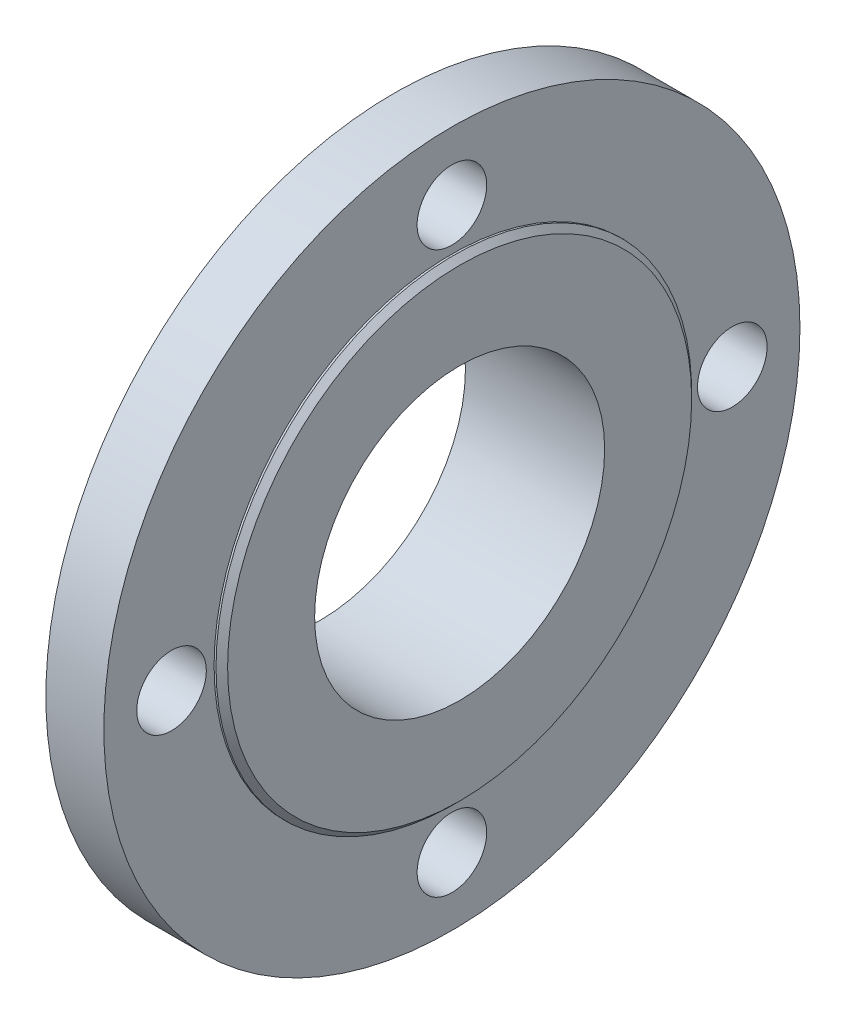
ISO-10303-21;
HEADER;
FILE_DESCRIPTION(('STEP AP214'),'2;1');
FILE_NAME('part.step','',(''),(''),'','','');
FILE_SCHEMA(('AUTOMOTIVE_DESIGN { 1 0 10303 214 1 1 1 1 }'));
ENDSEC;
DATA;
#1=APPLICATION_CONTEXT('core data for automotive mechanical design processes');
#2=APPLICATION_PROTOCOL_DEFINITION('international standard','automotive_design',2000,#1);
#3=PRODUCT_CONTEXT('',#1,'mechanical');
#4=PRODUCT('Part','Part','',(#3));
#5=PRODUCT_RELATED_PRODUCT_CATEGORY('part','',(#4));
#6=PRODUCT_DEFINITION_FORMATION('','',#4);
#7=PRODUCT_DEFINITION_CONTEXT('part definition',#1,'design');
#8=PRODUCT_DEFINITION('design','',#6,#7);
#9=PRODUCT_DEFINITION_SHAPE('','',#8);
#10=(LENGTH_UNIT() NAMED_UNIT(*) SI_UNIT(.MILLI.,.METRE.));
#11=(NAMED_UNIT(*) PLANE_ANGLE_UNIT() SI_UNIT($,.RADIAN.));
#12=(NAMED_UNIT(*) SI_UNIT($,.STERADIAN.) SOLID_ANGLE_UNIT());
#13=UNCERTAINTY_MEASURE_WITH_UNIT(LENGTH_MEASURE(1.E-05),#10,'distance_accuracy_value','');
#14=(GEOMETRIC_REPRESENTATION_CONTEXT(3) GLOBAL_UNCERTAINTY_ASSIGNED_CONTEXT((#13)) GLOBAL_UNIT_ASSIGNED_CONTEXT((#10,
#11,#12)) REPRESENTATION_CONTEXT('',''));
#15=CARTESIAN_POINT('',(0.,0.,0.));
#16=DIRECTION('',(0.,0.,1.));
#17=DIRECTION('',(1.,0.,0.));
#18=AXIS2_PLACEMENT_3D('',#15,#16,#17);
#19=CARTESIAN_POINT('',(0.,37.5,0.));
#20=DIRECTION('',(1.,0.,0.));
#21=DIRECTION('',(0.,0.,-1.));
#22=AXIS2_PLACEMENT_3D('',#19,#20,#21);
#23=PLANE('',#22);
#24=CARTESIAN_POINT('',(0.,0.,0.));
#25=DIRECTION('',(1.,0.,0.));
#26=DIRECTION('',(0.,0.,-1.));
#27=AXIS2_PLACEMENT_3D('',#24,#25,#26);
#28=CIRCLE('',#27,90.);
#29=CARTESIAN_POINT('',(0.,0.,-90.));
#30=VERTEX_POINT('',#29);
#31=EDGE_CURVE('E49',#30,#30,#28,.T.);
#32=ORIENTED_EDGE('',*,*,#31,.T.);
#33=EDGE_LOOP('',(#32));
#34=FACE_BOUND('',#33,.T.);
#35=CARTESIAN_POINT('',(0.,72.5,0.));
#36=DIRECTION('',(1.,0.,0.));
#37=DIRECTION('',(0.,0.,-1.));
#38=AXIS2_PLACEMENT_3D('',#35,#36,#37);
#39=CIRCLE('',#38,9.);
#40=CARTESIAN_POINT('',(0.,72.5,-9.));
#41=VERTEX_POINT('',#40);
#42=EDGE_CURVE('E55',#41,#41,#39,.T.);
#43=ORIENTED_EDGE('',*,*,#42,.F.);
#44=EDGE_LOOP('',(#43));
#45=FACE_BOUND('',#44,.T.);
#46=CARTESIAN_POINT('',(0.,-2.5313254368043E-13,72.5));
#47=DIRECTION('',(1.,0.,0.));
#48=DIRECTION('',(0.,1.,0.));
#49=AXIS2_PLACEMENT_3D('',#46,#47,#48);
#50=CIRCLE('',#49,9.);
#51=CARTESIAN_POINT('',(0.,8.99999999999974,72.5));
#52=VERTEX_POINT('',#51);
#53=EDGE_CURVE('E69',#52,#52,#50,.T.);
#54=ORIENTED_EDGE('',*,*,#53,.F.);
#55=EDGE_LOOP('',(#54));
#56=FACE_BOUND('',#55,.T.);
#57=CARTESIAN_POINT('',(0.,-72.5,-5.0626508736086E-13));
#58=DIRECTION('',(1.,0.,0.));
#59=DIRECTION('',(0.,0.,1.));
#60=AXIS2_PLACEMENT_3D('',#57,#58,#59);
#61=CIRCLE('',#60,9.);
#62=CARTESIAN_POINT('',(0.,-72.5000000000001,8.99999999999949));
#63=VERTEX_POINT('',#62);
#64=EDGE_CURVE('E75',#63,#63,#61,.T.);
#65=ORIENTED_EDGE('',*,*,#64,.F.);
#66=EDGE_LOOP('',(#65));
#67=FACE_BOUND('',#66,.T.);
#68=CARTESIAN_POINT('',(0.,7.59397631041291E-13,-72.5));
#69=DIRECTION('',(1.,0.,0.));
#70=DIRECTION('',(0.,-1.,0.));
#71=AXIS2_PLACEMENT_3D('',#68,#69,#70);
#72=CIRCLE('',#71,9.);
#73=CARTESIAN_POINT('',(0.,-8.99999999999924,-72.5000000000001));
#74=VERTEX_POINT('',#73);
#75=EDGE_CURVE('E81',#74,#74,#72,.T.);
#76=ORIENTED_EDGE('',*,*,#75,.F.);
#77=EDGE_LOOP('',(#76));
#78=FACE_BOUND('',#77,.T.);
#79=CARTESIAN_POINT('',(0.,0.,0.));
#80=DIRECTION('',(1.,0.,0.));
#81=DIRECTION('',(0.,0.,-1.));
#82=AXIS2_PLACEMENT_3D('',#79,#80,#81);
#83=CIRCLE('',#82,61.5);
#84=CARTESIAN_POINT('',(0.,0.,-61.5));
#85=VERTEX_POINT('',#84);
#86=EDGE_CURVE('E87',#85,#85,#83,.T.);
#87=ORIENTED_EDGE('',*,*,#86,.F.);
#88=EDGE_LOOP('',(#87));
#89=FACE_BOUND('',#88,.T.);
#90=ADVANCED_FACE('F34',(#34,#45,#56,#67,#78,#89),#23,.T.);
#91=CARTESIAN_POINT('',(-34.,44.7,0.));
#92=DIRECTION('',(-1.,0.,0.));
#93=DIRECTION('',(0.,0.,1.));
#94=AXIS2_PLACEMENT_3D('',#91,#92,#93);
#95=PLANE('',#94);
#96=CARTESIAN_POINT('',(-34.,0.,0.));
#97=DIRECTION('',(1.,0.,0.));
#98=DIRECTION('',(0.,0.,-1.));
#99=AXIS2_PLACEMENT_3D('',#96,#97,#98);
#100=CIRCLE('',#99,37.5);
#101=CARTESIAN_POINT('',(-34.,0.,-37.5));
#102=VERTEX_POINT('',#101);
#103=EDGE_CURVE('E45',#102,#102,#100,.T.);
#104=ORIENTED_EDGE('',*,*,#103,.T.);
#105=EDGE_LOOP('',(#104));
#106=FACE_BOUND('',#105,.T.);
#107=CARTESIAN_POINT('',(-34.,0.,0.));
#108=DIRECTION('',(1.,0.,0.));
#109=DIRECTION('',(0.,0.,-1.));
#110=AXIS2_PLACEMENT_3D('',#107,#108,#109);
#111=CIRCLE('',#110,44.7);
#112=CARTESIAN_POINT('',(-34.,0.,-44.7));
#113=VERTEX_POINT('',#112);
#114=EDGE_CURVE('E54',#113,#113,#111,.T.);
#115=ORIENTED_EDGE('',*,*,#114,.F.);
#116=EDGE_LOOP('',(#115));
#117=FACE_BOUND('',#116,.T.);
#118=ADVANCED_FACE('F110',(#106,#117),#95,.T.);
#119=CARTESIAN_POINT('',(0.,0.,0.));
#120=DIRECTION('',(1.,0.,0.));
#121=DIRECTION('',(0.,0.,-1.));
#122=AXIS2_PLACEMENT_3D('',#119,#120,#121);
#123=CYLINDRICAL_SURFACE('',#122,37.5);
#124=ORIENTED_EDGE('',*,*,#103,.F.);
#125=EDGE_LOOP('',(#124));
#126=FACE_BOUND('',#125,.T.);
#127=CARTESIAN_POINT('',(2.,0.,0.));
#128=DIRECTION('',(1.,0.,0.));
#129=DIRECTION('',(0.,0.,-1.));
#130=AXIS2_PLACEMENT_3D('',#127,#128,#129);
#131=CIRCLE('',#130,37.5);
#132=CARTESIAN_POINT('',(2.,0.,-37.5));
#133=VERTEX_POINT('',#132);
#134=EDGE_CURVE('E90',#133,#133,#131,.T.);
#135=ORIENTED_EDGE('',*,*,#134,.T.);
#136=EDGE_LOOP('',(#135));
#137=FACE_BOUND('',#136,.T.);
#138=ADVANCED_FACE('F94',(#126,#137),#123,.F.);
#139=CARTESIAN_POINT('',(0.,0.,0.));
#140=DIRECTION('',(1.,0.,0.));
#141=DIRECTION('',(0.,0.,-1.));
#142=AXIS2_PLACEMENT_3D('',#139,#140,#141);
#143=CYLINDRICAL_SURFACE('',#142,90.);
#144=CARTESIAN_POINT('',(-15.,0.,0.));
#145=DIRECTION('',(1.,0.,0.));
#146=DIRECTION('',(0.,0.,-1.));
#147=AXIS2_PLACEMENT_3D('',#144,#145,#146);
#148=CIRCLE('',#147,90.);
#149=CARTESIAN_POINT('',(-15.,0.,-90.));
#150=VERTEX_POINT('',#149);
#151=EDGE_CURVE('E59',#150,#150,#148,.T.);
#152=ORIENTED_EDGE('',*,*,#151,.T.);
#153=EDGE_LOOP('',(#152));
#154=FACE_BOUND('',#153,.T.);
#155=ORIENTED_EDGE('',*,*,#31,.F.);
#156=EDGE_LOOP('',(#155));
#157=FACE_BOUND('',#156,.T.);
#158=ADVANCED_FACE('F120',(#154,#157),#143,.T.);
#159=CARTESIAN_POINT('',(-15.,90.,0.));
#160=DIRECTION('',(-1.,0.,0.));
#161=DIRECTION('',(0.,0.,1.));
#162=AXIS2_PLACEMENT_3D('',#159,#160,#161);
#163=PLANE('',#162);
#164=CARTESIAN_POINT('',(-15.,7.59397631041291E-13,-72.5));
#165=DIRECTION('',(-1.,0.,0.));
#166=DIRECTION('',(0.,1.,0.));
#167=AXIS2_PLACEMENT_3D('',#164,#165,#166);
#168=CIRCLE('',#167,9.);
#169=CARTESIAN_POINT('',(-15.,9.00000000000076,-72.4999999999999));
#170=VERTEX_POINT('',#169);
#171=EDGE_CURVE('E84',#170,#170,#168,.T.);
#172=ORIENTED_EDGE('',*,*,#171,.F.);
#173=EDGE_LOOP('',(#172));
#174=FACE_BOUND('',#173,.T.);
#175=CARTESIAN_POINT('',(-15.,-72.5,-5.0626508736086E-13));
#176=DIRECTION('',(-1.,0.,0.));
#177=DIRECTION('',(0.,0.,-1.));
#178=AXIS2_PLACEMENT_3D('',#175,#176,#177);
#179=CIRCLE('',#178,9.);
#180=CARTESIAN_POINT('',(-15.,-72.4999999999999,-9.0000000000005));
#181=VERTEX_POINT('',#180);
#182=EDGE_CURVE('E78',#181,#181,#179,.T.);
#183=ORIENTED_EDGE('',*,*,#182,.F.);
#184=EDGE_LOOP('',(#183));
#185=FACE_BOUND('',#184,.T.);
#186=CARTESIAN_POINT('',(-15.,-2.5313254368043E-13,72.5));
#187=DIRECTION('',(-1.,0.,0.));
#188=DIRECTION('',(0.,-1.,0.));
#189=AXIS2_PLACEMENT_3D('',#186,#187,#188);
#190=CIRCLE('',#189,9.);
#191=CARTESIAN_POINT('',(-15.,-9.00000000000025,72.5));
#192=VERTEX_POINT('',#191);
#193=EDGE_CURVE('E72',#192,#192,#190,.T.);
#194=ORIENTED_EDGE('',*,*,#193,.F.);
#195=EDGE_LOOP('',(#194));
#196=FACE_BOUND('',#195,.T.);
#197=CARTESIAN_POINT('',(-15.,72.5,0.));
#198=DIRECTION('',(-1.,0.,0.));
#199=DIRECTION('',(0.,0.,1.));
#200=AXIS2_PLACEMENT_3D('',#197,#198,#199);
#201=CIRCLE('',#200,9.);
#202=CARTESIAN_POINT('',(-15.,72.5,9.));
#203=VERTEX_POINT('',#202);
#204=EDGE_CURVE('E52',#203,#203,#201,.T.);
#205=ORIENTED_EDGE('',*,*,#204,.F.);
#206=EDGE_LOOP('',(#205));
#207=FACE_BOUND('',#206,.T.);
#208=CARTESIAN_POINT('',(-15.,0.,0.));
#209=DIRECTION('',(1.,0.,0.));
#210=DIRECTION('',(0.,0.,-1.));
#211=AXIS2_PLACEMENT_3D('',#208,#209,#210);
#212=CIRCLE('',#211,44.7);
#213=CARTESIAN_POINT('',(-15.,0.,-44.7));
#214=VERTEX_POINT('',#213);
#215=EDGE_CURVE('E62',#214,#214,#212,.T.);
#216=ORIENTED_EDGE('',*,*,#215,.T.);
#217=EDGE_LOOP('',(#216));
#218=FACE_BOUND('',#217,.T.);
#219=ORIENTED_EDGE('',*,*,#151,.F.);
#220=EDGE_LOOP('',(#219));
#221=FACE_BOUND('',#220,.T.);
#222=ADVANCED_FACE('F127',(#174,#185,#196,#207,#218,#221),#163,.T.);
#223=CARTESIAN_POINT('',(0.,0.,0.));
#224=DIRECTION('',(1.,0.,0.));
#225=DIRECTION('',(0.,0.,-1.));
#226=AXIS2_PLACEMENT_3D('',#223,#224,#225);
#227=CYLINDRICAL_SURFACE('',#226,44.7);
#228=ORIENTED_EDGE('',*,*,#114,.T.);
#229=EDGE_LOOP('',(#228));
#230=FACE_BOUND('',#229,.T.);
#231=ORIENTED_EDGE('',*,*,#215,.F.);
#232=EDGE_LOOP('',(#231));
#233=FACE_BOUND('',#232,.T.);
#234=ADVANCED_FACE('F133',(#230,#233),#227,.T.);
#235=CARTESIAN_POINT('',(-34.,72.5,0.));
#236=DIRECTION('',(1.,0.,0.));
#237=DIRECTION('',(0.,0.,-1.));
#238=AXIS2_PLACEMENT_3D('',#235,#236,#237);
#239=CYLINDRICAL_SURFACE('',#238,9.);
#240=ORIENTED_EDGE('',*,*,#204,.T.);
#241=EDGE_LOOP('',(#240));
#242=FACE_BOUND('',#241,.T.);
#243=ORIENTED_EDGE('',*,*,#42,.T.);
#244=EDGE_LOOP('',(#243));
#245=FACE_BOUND('',#244,.T.);
#246=ADVANCED_FACE('F136',(#242,#245),#239,.F.);
#247=CARTESIAN_POINT('',(-34.,-2.5313254368043E-13,72.5));
#248=DIRECTION('',(1.,0.,0.));
#249=DIRECTION('',(0.,1.,0.));
#250=AXIS2_PLACEMENT_3D('',#247,#248,#249);
#251=CYLINDRICAL_SURFACE('',#250,9.);
#252=ORIENTED_EDGE('',*,*,#193,.T.);
#253=EDGE_LOOP('',(#252));
#254=FACE_BOUND('',#253,.T.);
#255=ORIENTED_EDGE('',*,*,#53,.T.);
#256=EDGE_LOOP('',(#255));
#257=FACE_BOUND('',#256,.T.);
#258=ADVANCED_FACE('F153',(#254,#257),#251,.F.);
#259=CARTESIAN_POINT('',(-34.,-72.5,-5.0626508736086E-13));
#260=DIRECTION('',(1.,0.,0.));
#261=DIRECTION('',(0.,0.,1.));
#262=AXIS2_PLACEMENT_3D('',#259,#260,#261);
#263=CYLINDRICAL_SURFACE('',#262,9.);
#264=ORIENTED_EDGE('',*,*,#182,.T.);
#265=EDGE_LOOP('',(#264));
#266=FACE_BOUND('',#265,.T.);
#267=ORIENTED_EDGE('',*,*,#64,.T.);
#268=EDGE_LOOP('',(#267));
#269=FACE_BOUND('',#268,.T.);
#270=ADVANCED_FACE('F106',(#266,#269),#263,.F.);
#271=CARTESIAN_POINT('',(-34.,7.59397631041291E-13,-72.5));
#272=DIRECTION('',(1.,0.,0.));
#273=DIRECTION('',(0.,-1.,0.));
#274=AXIS2_PLACEMENT_3D('',#271,#272,#273);
#275=CYLINDRICAL_SURFACE('',#274,9.);
#276=ORIENTED_EDGE('',*,*,#171,.T.);
#277=EDGE_LOOP('',(#276));
#278=FACE_BOUND('',#277,.T.);
#279=ORIENTED_EDGE('',*,*,#75,.T.);
#280=EDGE_LOOP('',(#279));
#281=FACE_BOUND('',#280,.T.);
#282=ADVANCED_FACE('F99',(#278,#281),#275,.F.);
#283=CARTESIAN_POINT('',(2.,0.,0.));
#284=DIRECTION('',(1.,0.,0.));
#285=DIRECTION('',(0.,0.,-1.));
#286=AXIS2_PLACEMENT_3D('',#283,#284,#285);
#287=PLANE('',#286);
#288=CARTESIAN_POINT('',(2.,0.,0.));
#289=DIRECTION('',(1.,0.,0.));
#290=DIRECTION('',(0.,0.,-1.));
#291=AXIS2_PLACEMENT_3D('',#288,#289,#290);
#292=CIRCLE('',#291,60.);
#293=CARTESIAN_POINT('',(2.,0.,60.));
#294=VERTEX_POINT('',#293);
#295=EDGE_CURVE('E41',#294,#294,#292,.T.);
#296=ORIENTED_EDGE('',*,*,#295,.T.);
#297=EDGE_LOOP('',(#296));
#298=FACE_BOUND('',#297,.T.);
#299=ORIENTED_EDGE('',*,*,#134,.F.);
#300=EDGE_LOOP('',(#299));
#301=FACE_BOUND('',#300,.T.);
#302=ADVANCED_FACE('F96',(#298,#301),#287,.T.);
#303=CARTESIAN_POINT('',(2.,0.,0.));
#304=DIRECTION('',(-1.,0.,0.));
#305=DIRECTION('',(0.,0.,1.));
#306=AXIS2_PLACEMENT_3D('',#303,#304,#305);
#307=CYLINDRICAL_SURFACE('',#306,61.5);
#308=CARTESIAN_POINT('',(0.499999999999957,0.,0.));
#309=DIRECTION('',(1.,0.,0.));
#310=DIRECTION('',(0.,0.,-1.));
#311=AXIS2_PLACEMENT_3D('',#308,#309,#310);
#312=CIRCLE('',#311,61.5);
#313=CARTESIAN_POINT('',(0.499999999999957,0.,61.5));
#314=VERTEX_POINT('',#313);
#315=EDGE_CURVE('E10',#314,#314,#312,.F.);
#316=ORIENTED_EDGE('',*,*,#315,.T.);
#317=EDGE_LOOP('',(#316));
#318=FACE_BOUND('',#317,.T.);
#319=ORIENTED_EDGE('',*,*,#86,.T.);
#320=EDGE_LOOP('',(#319));
#321=FACE_BOUND('',#320,.T.);
#322=ADVANCED_FACE('F98',(#318,#321),#307,.T.);
#323=CARTESIAN_POINT('',(2.,0.,0.));
#324=DIRECTION('',(-1.,0.,0.));
#325=DIRECTION('',(0.,0.,1.));
#326=AXIS2_PLACEMENT_3D('',#323,#324,#325);
#327=CONICAL_SURFACE('',#326,60.,0.785398163397437);
#328=CARTESIAN_POINT('',(0.499999999999957,0.,61.5));
#329=CARTESIAN_POINT('',(0.515624999999956,0.,61.484375));
#330=CARTESIAN_POINT('',(0.531249999999957,0.,61.46875));
#331=CARTESIAN_POINT('',(0.562499999999959,0.,61.4375));
#332=CARTESIAN_POINT('',(0.57812499999996,0.,61.421875));
#333=CARTESIAN_POINT('',(0.609374999999961,0.,61.390625));
#334=CARTESIAN_POINT('',(0.624999999999961,0.,61.375));
#335=CARTESIAN_POINT('',(0.656249999999961,0.,61.34375));
#336=CARTESIAN_POINT('',(0.671874999999962,0.,61.328125));
#337=CARTESIAN_POINT('',(0.703124999999963,0.,61.296875));
#338=CARTESIAN_POINT('',(0.718749999999963,0.,61.28125));
#339=CARTESIAN_POINT('',(0.749999999999964,0.,61.25));
#340=CARTESIAN_POINT('',(0.765624999999964,0.,61.234375));
#341=CARTESIAN_POINT('',(0.796874999999965,0.,61.203125));
#342=CARTESIAN_POINT('',(0.812499999999966,0.,61.1875));
#343=CARTESIAN_POINT('',(0.843749999999967,0.,61.15625));
#344=CARTESIAN_POINT('',(0.859374999999967,0.,61.140625));
#345=CARTESIAN_POINT('',(0.890624999999968,0.,61.109375));
#346=CARTESIAN_POINT('',(0.906249999999968,0.,61.09375));
#347=CARTESIAN_POINT('',(0.937499999999969,0.,61.0625));
#348=CARTESIAN_POINT('',(0.95312499999997,0.,61.046875));
#349=CARTESIAN_POINT('',(0.98437499999997,0.,61.015625));
#350=CARTESIAN_POINT('',(0.999999999999971,0.,61.));
#351=CARTESIAN_POINT('',(1.03124999999997,0.,60.96875));
#352=CARTESIAN_POINT('',(1.04687499999997,0.,60.953125));
#353=CARTESIAN_POINT('',(1.07812499999997,0.,60.921875));
#354=CARTESIAN_POINT('',(1.09374999999997,0.,60.90625));
#355=CARTESIAN_POINT('',(1.12499999999997,0.,60.875));
#356=CARTESIAN_POINT('',(1.14062499999998,0.,60.859375));
#357=CARTESIAN_POINT('',(1.17187499999998,0.,60.828125));
#358=CARTESIAN_POINT('',(1.18749999999998,0.,60.8125));
#359=CARTESIAN_POINT('',(1.21874999999998,0.,60.78125));
#360=CARTESIAN_POINT('',(1.23437499999998,0.,60.765625));
#361=CARTESIAN_POINT('',(1.26562499999998,0.,60.734375));
#362=CARTESIAN_POINT('',(1.28124999999998,0.,60.71875));
#363=CARTESIAN_POINT('',(1.31249999999998,0.,60.6875));
#364=CARTESIAN_POINT('',(1.32812499999998,0.,60.671875));
#365=CARTESIAN_POINT('',(1.35937499999998,0.,60.640625));
#366=CARTESIAN_POINT('',(1.37499999999998,0.,60.625));
#367=CARTESIAN_POINT('',(1.40624999999998,0.,60.59375));
#368=CARTESIAN_POINT('',(1.42187499999998,0.,60.578125));
#369=CARTESIAN_POINT('',(1.45312499999998,0.,60.546875));
#370=CARTESIAN_POINT('',(1.46874999999999,0.,60.53125));
#371=CARTESIAN_POINT('',(1.49999999999999,0.,60.5));
#372=CARTESIAN_POINT('',(1.51562499999999,0.,60.484375));
#373=CARTESIAN_POINT('',(1.54687499999999,0.,60.453125));
#374=CARTESIAN_POINT('',(1.56249999999999,0.,60.4375));
#375=CARTESIAN_POINT('',(1.59374999999999,0.,60.40625));
#376=CARTESIAN_POINT('',(1.60937499999999,0.,60.390625));
#377=CARTESIAN_POINT('',(1.64062499999999,0.,60.359375));
#378=CARTESIAN_POINT('',(1.65624999999999,0.,60.34375));
#379=CARTESIAN_POINT('',(1.68749999999999,0.,60.3125));
#380=CARTESIAN_POINT('',(1.70312499999999,0.,60.296875));
#381=CARTESIAN_POINT('',(1.73437499999999,0.,60.265625));
#382=CARTESIAN_POINT('',(1.74999999999999,0.,60.25));
#383=CARTESIAN_POINT('',(1.78124999999999,0.,60.21875));
#384=CARTESIAN_POINT('',(1.79687499999999,0.,60.203125));
#385=CARTESIAN_POINT('',(1.82812499999999,0.,60.171875));
#386=CARTESIAN_POINT('',(1.84374999999999,0.,60.15625));
#387=CARTESIAN_POINT('',(1.875,0.,60.125));
#388=CARTESIAN_POINT('',(1.890625,0.,60.109375));
#389=CARTESIAN_POINT('',(1.921875,0.,60.078125));
#390=CARTESIAN_POINT('',(1.9375,0.,60.0625));
#391=CARTESIAN_POINT('',(1.96875,0.,60.03125));
#392=CARTESIAN_POINT('',(1.984375,0.,60.015625));
#393=CARTESIAN_POINT('',(2.,0.,60.));
#394=B_SPLINE_CURVE_WITH_KNOTS('',3,(#328,#329,#330,#331,#332,#333,#334,#335,#336,#337,#338,
#339,#340,#341,#342,#343,#344,#345,#346,#347,#348,#349,#350,#351,#352,#353,#354,#355,#356,#357,
#358,#359,#360,#361,#362,#363,#364,#365,#366,#367,#368,#369,#370,#371,#372,#373,#374,#375,#376,
#377,#378,#379,#380,#381,#382,#383,#384,#385,#386,#387,#388,#389,#390,#391,#392,#393),
.UNSPECIFIED.,.F.,.F.,(4,2,2,2,2,2,2,2,2,2,2,2,2,2,2,2,2,2,2,2,2,2,2,2,2,2,2,2,2,2,2,2,4),(0.,
0.066291260736241,0.132582521472477,0.198873782208718,0.265165042944959,0.3314563036812,
0.397747564417441,0.464038825153677,0.530330085889918,0.59662134662616,0.6629126073624,
0.729203868098641,0.795495128834878,0.861786389571119,0.92807765030736,0.994368911043601,
1.06066017177984,1.12695143251608,1.19324269325232,1.25953395398856,1.3258252147248,
1.39211647546104,1.45840773619728,1.52469899693352,1.59099025766976,1.657281518406,
1.72357277914224,1.78986403987848,1.85615530061472,1.92244656135096,1.9887378220872,
2.05502908282344,2.12132034355968),.UNSPECIFIED.);
#395=EDGE_CURVE('BSEAM36',#314,#294,#394,.T.);
#396=ORIENTED_EDGE('',*,*,#315,.F.);
#397=ORIENTED_EDGE('',*,*,#295,.F.);
#398=ORIENTED_EDGE('',*,*,#395,.T.);
#399=ORIENTED_EDGE('',*,*,#395,.F.);
#400=EDGE_LOOP('',(#396,#398,#397,#399));
#401=FACE_BOUND('',#400,.T.);
#402=ADVANCED_FACE('F36',(#401),#327,.T.);
#403=CLOSED_SHELL('',(#90,#118,#138,#158,#222,#234,#246,#258,#270,#282,#302,#322,#402));
#404=MANIFOLD_SOLID_BREP('B2',#403);
#405=ADVANCED_BREP_SHAPE_REPRESENTATION('',(#18,#404),#14);
#406=SHAPE_DEFINITION_REPRESENTATION(#9,#405);
ENDSEC;
END-ISO-10303-21;
